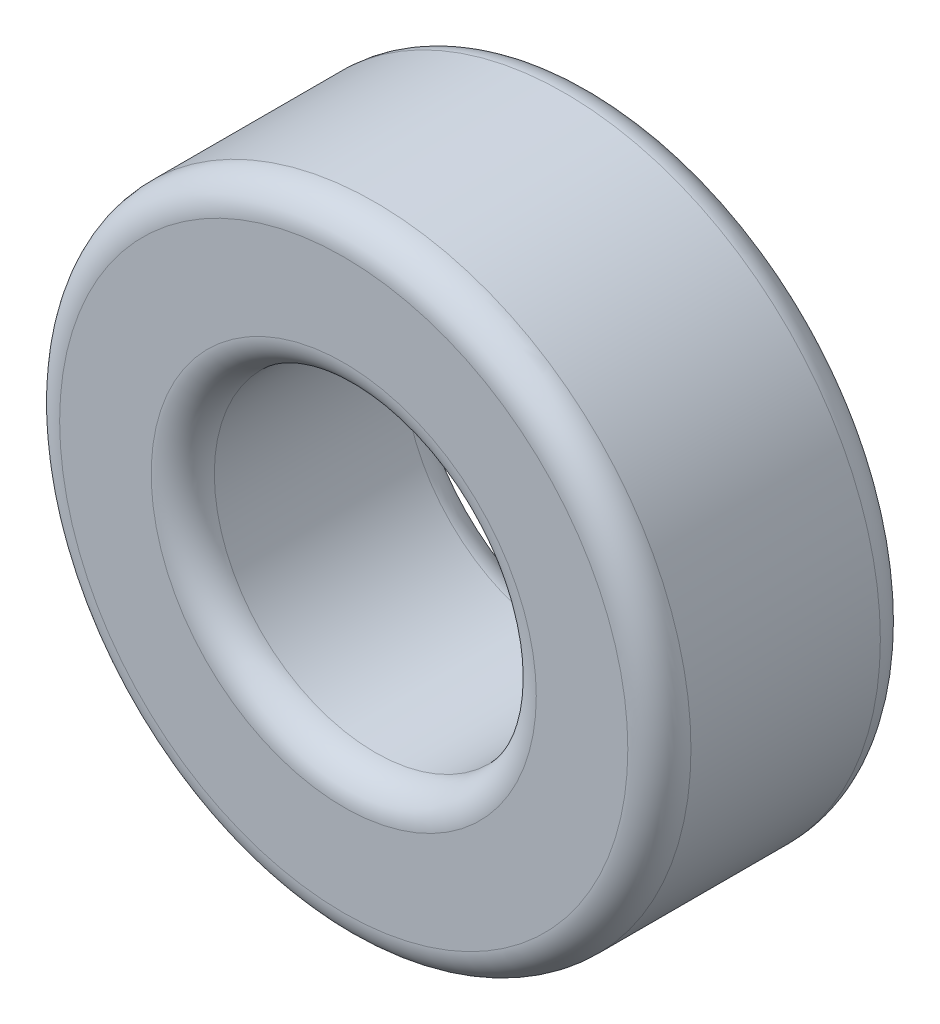
ISO-10303-21;
HEADER;
FILE_DESCRIPTION(('STEP AP214'),'2;1');
FILE_NAME('part.step','',(''),(''),'','','');
FILE_SCHEMA(('AUTOMOTIVE_DESIGN { 1 0 10303 214 1 1 1 1 }'));
ENDSEC;
DATA;
#1=APPLICATION_CONTEXT('core data for automotive mechanical design processes');
#2=APPLICATION_PROTOCOL_DEFINITION('international standard','automotive_design',2000,#1);
#3=PRODUCT_CONTEXT('',#1,'mechanical');
#4=PRODUCT('Part','Part','',(#3));
#5=PRODUCT_RELATED_PRODUCT_CATEGORY('part','',(#4));
#6=PRODUCT_DEFINITION_FORMATION('','',#4);
#7=PRODUCT_DEFINITION_CONTEXT('part definition',#1,'design');
#8=PRODUCT_DEFINITION('design','',#6,#7);
#9=PRODUCT_DEFINITION_SHAPE('','',#8);
#10=(LENGTH_UNIT() NAMED_UNIT(*) SI_UNIT(.MILLI.,.METRE.));
#11=(NAMED_UNIT(*) PLANE_ANGLE_UNIT() SI_UNIT($,.RADIAN.));
#12=(NAMED_UNIT(*) SI_UNIT($,.STERADIAN.) SOLID_ANGLE_UNIT());
#13=UNCERTAINTY_MEASURE_WITH_UNIT(LENGTH_MEASURE(1.E-05),#10,'distance_accuracy_value','');
#14=(GEOMETRIC_REPRESENTATION_CONTEXT(3) GLOBAL_UNCERTAINTY_ASSIGNED_CONTEXT((#13)) GLOBAL_UNIT_ASSIGNED_CONTEXT((#10,
#11,#12)) REPRESENTATION_CONTEXT('',''));
#15=CARTESIAN_POINT('',(0.,0.,0.));
#16=DIRECTION('',(0.,0.,1.));
#17=DIRECTION('',(1.,0.,0.));
#18=AXIS2_PLACEMENT_3D('',#15,#16,#17);
#19=CARTESIAN_POINT('',(0.,0.,10.16));
#20=DIRECTION('',(0.,0.,1.));
#21=DIRECTION('',(1.,0.,0.));
#22=AXIS2_PLACEMENT_3D('',#19,#20,#21);
#23=PLANE('',#22);
#24=CARTESIAN_POINT('',(0.,0.,10.16));
#25=DIRECTION('',(0.,0.,1.));
#26=DIRECTION('',(1.,0.,0.));
#27=AXIS2_PLACEMENT_3D('',#24,#25,#26);
#28=CIRCLE('',#27,7.747);
#29=CARTESIAN_POINT('',(7.747,0.,10.16));
#30=VERTEX_POINT('',#29);
#31=EDGE_CURVE('E10',#30,#30,#28,.F.);
#32=ORIENTED_EDGE('',*,*,#31,.T.);
#33=EDGE_LOOP('',(#32));
#34=FACE_BOUND('',#33,.T.);
#35=CARTESIAN_POINT('',(0.,0.,10.16));
#36=DIRECTION('',(0.,0.,1.));
#37=DIRECTION('',(1.,0.,0.));
#38=AXIS2_PLACEMENT_3D('',#35,#36,#37);
#39=CIRCLE('',#38,11.43);
#40=CARTESIAN_POINT('',(11.43,0.,10.16));
#41=VERTEX_POINT('',#40);
#42=EDGE_CURVE('E38',#41,#41,#39,.T.);
#43=ORIENTED_EDGE('',*,*,#42,.T.);
#44=EDGE_LOOP('',(#43));
#45=FACE_BOUND('',#44,.T.);
#46=ADVANCED_FACE('F31',(#34,#45),#23,.T.);
#47=CARTESIAN_POINT('',(0.,0.,0.));
#48=DIRECTION('',(0.,0.,1.));
#49=DIRECTION('',(1.,0.,0.));
#50=AXIS2_PLACEMENT_3D('',#47,#48,#49);
#51=PLANE('',#50);
#52=CARTESIAN_POINT('',(0.,0.,0.));
#53=DIRECTION('',(0.,0.,1.));
#54=DIRECTION('',(1.,0.,0.));
#55=AXIS2_PLACEMENT_3D('',#52,#53,#54);
#56=CIRCLE('',#55,11.43);
#57=CARTESIAN_POINT('',(11.43,0.,0.));
#58=VERTEX_POINT('',#57);
#59=EDGE_CURVE('E51',#58,#58,#56,.F.);
#60=ORIENTED_EDGE('',*,*,#59,.T.);
#61=EDGE_LOOP('',(#60));
#62=FACE_BOUND('',#61,.T.);
#63=CARTESIAN_POINT('',(0.,0.,0.));
#64=DIRECTION('',(0.,0.,1.));
#65=DIRECTION('',(1.,0.,0.));
#66=AXIS2_PLACEMENT_3D('',#63,#64,#65);
#67=CIRCLE('',#66,7.747);
#68=CARTESIAN_POINT('',(7.747,0.,0.));
#69=VERTEX_POINT('',#68);
#70=EDGE_CURVE('E54',#69,#69,#67,.T.);
#71=ORIENTED_EDGE('',*,*,#70,.T.);
#72=EDGE_LOOP('',(#71));
#73=FACE_BOUND('',#72,.T.);
#74=ADVANCED_FACE('F75',(#62,#73),#51,.F.);
#75=CARTESIAN_POINT('',(0.,0.,10.16));
#76=DIRECTION('',(0.,0.,-1.));
#77=DIRECTION('',(-1.,0.,0.));
#78=AXIS2_PLACEMENT_3D('',#75,#76,#77);
#79=CYLINDRICAL_SURFACE('',#78,12.7);
#80=CARTESIAN_POINT('',(0.,0.,1.27));
#81=DIRECTION('',(0.,0.,1.));
#82=DIRECTION('',(1.,0.,0.));
#83=AXIS2_PLACEMENT_3D('',#80,#81,#82);
#84=CIRCLE('',#83,12.7);
#85=CARTESIAN_POINT('',(12.7,0.,1.27));
#86=VERTEX_POINT('',#85);
#87=EDGE_CURVE('E57',#86,#86,#84,.T.);
#88=ORIENTED_EDGE('',*,*,#87,.T.);
#89=EDGE_LOOP('',(#88));
#90=FACE_BOUND('',#89,.T.);
#91=CARTESIAN_POINT('',(0.,0.,8.89));
#92=DIRECTION('',(0.,0.,1.));
#93=DIRECTION('',(1.,0.,0.));
#94=AXIS2_PLACEMENT_3D('',#91,#92,#93);
#95=CIRCLE('',#94,12.7);
#96=CARTESIAN_POINT('',(12.7,0.,8.89));
#97=VERTEX_POINT('',#96);
#98=EDGE_CURVE('E60',#97,#97,#95,.F.);
#99=ORIENTED_EDGE('',*,*,#98,.T.);
#100=EDGE_LOOP('',(#99));
#101=FACE_BOUND('',#100,.T.);
#102=ADVANCED_FACE('F64',(#90,#101),#79,.T.);
#103=CARTESIAN_POINT('',(0.,0.,10.16));
#104=DIRECTION('',(0.,0.,-1.));
#105=DIRECTION('',(-1.,0.,0.));
#106=AXIS2_PLACEMENT_3D('',#103,#104,#105);
#107=CYLINDRICAL_SURFACE('',#106,6.477);
#108=CARTESIAN_POINT('',(0.,0.,1.27));
#109=DIRECTION('',(0.,0.,1.));
#110=DIRECTION('',(1.,0.,0.));
#111=AXIS2_PLACEMENT_3D('',#108,#109,#110);
#112=CIRCLE('',#111,6.477);
#113=CARTESIAN_POINT('',(6.477,0.,1.27));
#114=VERTEX_POINT('',#113);
#115=EDGE_CURVE('E42',#114,#114,#112,.F.);
#116=ORIENTED_EDGE('',*,*,#115,.T.);
#117=EDGE_LOOP('',(#116));
#118=FACE_BOUND('',#117,.T.);
#119=CARTESIAN_POINT('',(0.,0.,8.89));
#120=DIRECTION('',(0.,0.,1.));
#121=DIRECTION('',(1.,0.,0.));
#122=AXIS2_PLACEMENT_3D('',#119,#120,#121);
#123=CIRCLE('',#122,6.477);
#124=CARTESIAN_POINT('',(6.477,0.,8.89));
#125=VERTEX_POINT('',#124);
#126=EDGE_CURVE('E46',#125,#125,#123,.T.);
#127=ORIENTED_EDGE('',*,*,#126,.T.);
#128=EDGE_LOOP('',(#127));
#129=FACE_BOUND('',#128,.T.);
#130=ADVANCED_FACE('F83',(#118,#129),#107,.F.);
#131=CARTESIAN_POINT('',(0.,0.,1.27));
#132=DIRECTION('',(0.,0.,1.));
#133=DIRECTION('',(1.,0.,0.));
#134=AXIS2_PLACEMENT_3D('',#131,#132,#133);
#135=TOROIDAL_SURFACE('',#134,11.43,1.27);
#136=ORIENTED_EDGE('',*,*,#59,.F.);
#137=EDGE_LOOP('',(#136));
#138=FACE_BOUND('',#137,.T.);
#139=ORIENTED_EDGE('',*,*,#87,.F.);
#140=EDGE_LOOP('',(#139));
#141=FACE_BOUND('',#140,.T.);
#142=ADVANCED_FACE('F88',(#138,#141),#135,.T.);
#143=CARTESIAN_POINT('',(0.,0.,1.27));
#144=DIRECTION('',(0.,0.,1.));
#145=DIRECTION('',(1.,0.,0.));
#146=AXIS2_PLACEMENT_3D('',#143,#144,#145);
#147=TOROIDAL_SURFACE('',#146,7.747,1.27);
#148=ORIENTED_EDGE('',*,*,#115,.F.);
#149=EDGE_LOOP('',(#148));
#150=FACE_BOUND('',#149,.T.);
#151=ORIENTED_EDGE('',*,*,#70,.F.);
#152=EDGE_LOOP('',(#151));
#153=FACE_BOUND('',#152,.T.);
#154=ADVANCED_FACE('F72',(#150,#153),#147,.T.);
#155=CARTESIAN_POINT('',(0.,0.,8.89));
#156=DIRECTION('',(0.,0.,1.));
#157=DIRECTION('',(1.,0.,0.));
#158=AXIS2_PLACEMENT_3D('',#155,#156,#157);
#159=TOROIDAL_SURFACE('',#158,7.747,1.27);
#160=ORIENTED_EDGE('',*,*,#31,.F.);
#161=EDGE_LOOP('',(#160));
#162=FACE_BOUND('',#161,.T.);
#163=ORIENTED_EDGE('',*,*,#126,.F.);
#164=EDGE_LOOP('',(#163));
#165=FACE_BOUND('',#164,.T.);
#166=ADVANCED_FACE('F68',(#162,#165),#159,.T.);
#167=CARTESIAN_POINT('',(0.,0.,8.89));
#168=DIRECTION('',(0.,0.,1.));
#169=DIRECTION('',(1.,0.,0.));
#170=AXIS2_PLACEMENT_3D('',#167,#168,#169);
#171=TOROIDAL_SURFACE('',#170,11.43,1.27);
#172=ORIENTED_EDGE('',*,*,#98,.F.);
#173=EDGE_LOOP('',(#172));
#174=FACE_BOUND('',#173,.T.);
#175=ORIENTED_EDGE('',*,*,#42,.F.);
#176=EDGE_LOOP('',(#175));
#177=FACE_BOUND('',#176,.T.);
#178=ADVANCED_FACE('F33',(#174,#177),#171,.T.);
#179=CLOSED_SHELL('',(#46,#74,#102,#130,#142,#154,#166,#178));
#180=MANIFOLD_SOLID_BREP('B2',#179);
#181=ADVANCED_BREP_SHAPE_REPRESENTATION('',(#18,#180),#14);
#182=SHAPE_DEFINITION_REPRESENTATION(#9,#181);
ENDSEC;
END-ISO-10303-21;
